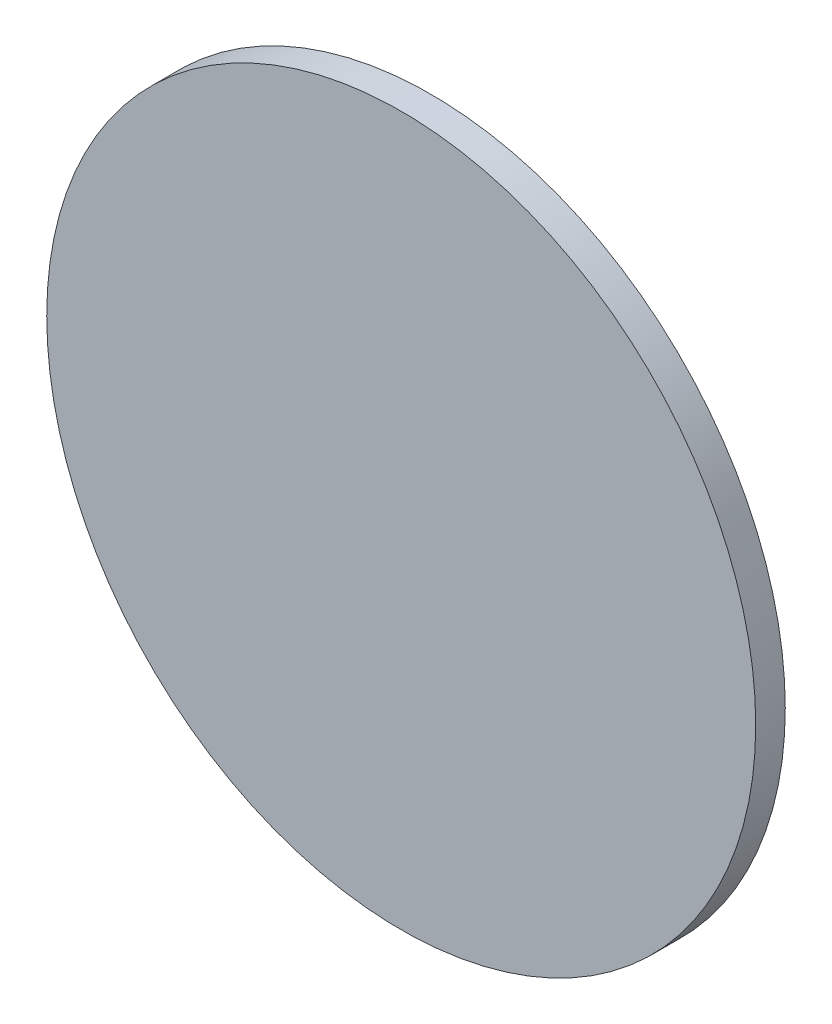
ISO-10303-21;
HEADER;
FILE_DESCRIPTION(('STEP AP214'),'2;1');
FILE_NAME('part.step','',(''),(''),'','','');
FILE_SCHEMA(('AUTOMOTIVE_DESIGN { 1 0 10303 214 1 1 1 1 }'));
ENDSEC;
DATA;
#1=APPLICATION_CONTEXT('core data for automotive mechanical design processes');
#2=APPLICATION_PROTOCOL_DEFINITION('international standard','automotive_design',2000,#1);
#3=PRODUCT_CONTEXT('',#1,'mechanical');
#4=PRODUCT('Part','Part','',(#3));
#5=PRODUCT_RELATED_PRODUCT_CATEGORY('part','',(#4));
#6=PRODUCT_DEFINITION_FORMATION('','',#4);
#7=PRODUCT_DEFINITION_CONTEXT('part definition',#1,'design');
#8=PRODUCT_DEFINITION('design','',#6,#7);
#9=PRODUCT_DEFINITION_SHAPE('','',#8);
#10=(LENGTH_UNIT() NAMED_UNIT(*) SI_UNIT(.MILLI.,.METRE.));
#11=(NAMED_UNIT(*) PLANE_ANGLE_UNIT() SI_UNIT($,.RADIAN.));
#12=(NAMED_UNIT(*) SI_UNIT($,.STERADIAN.) SOLID_ANGLE_UNIT());
#13=UNCERTAINTY_MEASURE_WITH_UNIT(LENGTH_MEASURE(1.E-05),#10,'distance_accuracy_value','');
#14=(GEOMETRIC_REPRESENTATION_CONTEXT(3) GLOBAL_UNCERTAINTY_ASSIGNED_CONTEXT((#13)) GLOBAL_UNIT_ASSIGNED_CONTEXT((#10,
#11,#12)) REPRESENTATION_CONTEXT('',''));
#15=CARTESIAN_POINT('',(0.,0.,0.));
#16=DIRECTION('',(0.,0.,1.));
#17=DIRECTION('',(1.,0.,0.));
#18=AXIS2_PLACEMENT_3D('',#15,#16,#17);
#19=CARTESIAN_POINT('',(0.,0.,5.));
#20=DIRECTION('',(0.,0.,-1.));
#21=DIRECTION('',(-1.,0.,0.));
#22=AXIS2_PLACEMENT_3D('',#19,#20,#21);
#23=CYLINDRICAL_SURFACE('',#22,60.);
#24=CARTESIAN_POINT('',(0.,0.,5.));
#25=DIRECTION('',(0.,0.,1.));
#26=DIRECTION('',(1.,0.,0.));
#27=AXIS2_PLACEMENT_3D('',#24,#25,#26);
#28=CIRCLE('',#27,60.);
#29=CARTESIAN_POINT('',(60.,0.,5.));
#30=VERTEX_POINT('',#29);
#31=EDGE_CURVE('E10',#30,#30,#28,.T.);
#32=ORIENTED_EDGE('',*,*,#31,.F.);
#33=EDGE_LOOP('',(#32));
#34=FACE_BOUND('',#33,.T.);
#35=CARTESIAN_POINT('',(0.,0.,0.));
#36=DIRECTION('',(0.,0.,1.));
#37=DIRECTION('',(1.,0.,0.));
#38=AXIS2_PLACEMENT_3D('',#35,#36,#37);
#39=CIRCLE('',#38,60.);
#40=CARTESIAN_POINT('',(60.,0.,0.));
#41=VERTEX_POINT('',#40);
#42=EDGE_CURVE('E32',#41,#41,#39,.T.);
#43=ORIENTED_EDGE('',*,*,#42,.T.);
#44=EDGE_LOOP('',(#43));
#45=FACE_BOUND('',#44,.T.);
#46=ADVANCED_FACE('F29',(#34,#45),#23,.T.);
#47=CARTESIAN_POINT('',(0.,0.,5.));
#48=DIRECTION('',(0.,0.,1.));
#49=DIRECTION('',(1.,0.,0.));
#50=AXIS2_PLACEMENT_3D('',#47,#48,#49);
#51=PLANE('',#50);
#52=ORIENTED_EDGE('',*,*,#31,.T.);
#53=EDGE_LOOP('',(#52));
#54=FACE_BOUND('',#53,.T.);
#55=ADVANCED_FACE('F44',(#54),#51,.T.);
#56=CARTESIAN_POINT('',(0.,0.,0.));
#57=DIRECTION('',(0.,0.,1.));
#58=DIRECTION('',(1.,0.,0.));
#59=AXIS2_PLACEMENT_3D('',#56,#57,#58);
#60=PLANE('',#59);
#61=ORIENTED_EDGE('',*,*,#42,.F.);
#62=EDGE_LOOP('',(#61));
#63=FACE_BOUND('',#62,.T.);
#64=ADVANCED_FACE('F42',(#63),#60,.F.);
#65=CLOSED_SHELL('',(#46,#55,#64));
#66=MANIFOLD_SOLID_BREP('B2',#65);
#67=ADVANCED_BREP_SHAPE_REPRESENTATION('',(#18,#66),#14);
#68=SHAPE_DEFINITION_REPRESENTATION(#9,#67);
ENDSEC;
END-ISO-10303-21;
